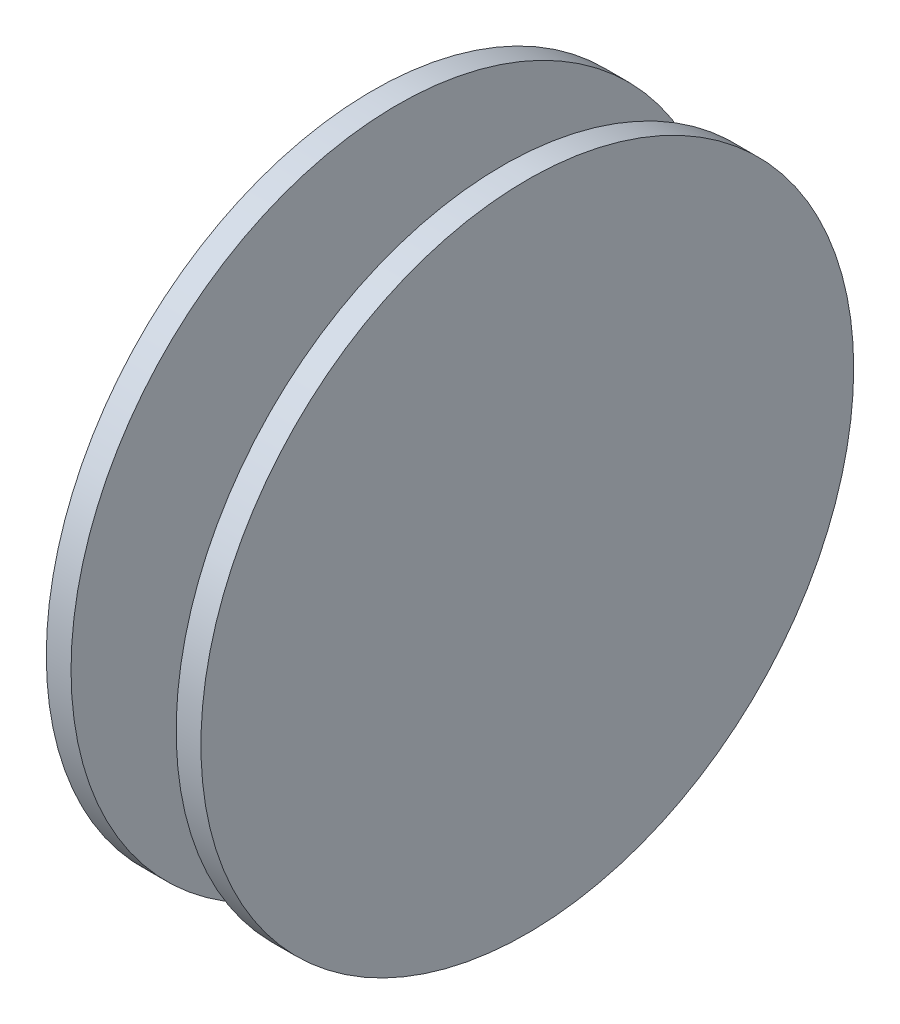
ISO-10303-21;
HEADER;
FILE_DESCRIPTION(('STEP AP214'),'2;1');
FILE_NAME('part.step','',(''),(''),'','','');
FILE_SCHEMA(('AUTOMOTIVE_DESIGN { 1 0 10303 214 1 1 1 1 }'));
ENDSEC;
DATA;
#1=APPLICATION_CONTEXT('core data for automotive mechanical design processes');
#2=APPLICATION_PROTOCOL_DEFINITION('international standard','automotive_design',2000,#1);
#3=PRODUCT_CONTEXT('',#1,'mechanical');
#4=PRODUCT('Part','Part','',(#3));
#5=PRODUCT_RELATED_PRODUCT_CATEGORY('part','',(#4));
#6=PRODUCT_DEFINITION_FORMATION('','',#4);
#7=PRODUCT_DEFINITION_CONTEXT('part definition',#1,'design');
#8=PRODUCT_DEFINITION('design','',#6,#7);
#9=PRODUCT_DEFINITION_SHAPE('','',#8);
#10=(LENGTH_UNIT() NAMED_UNIT(*) SI_UNIT(.MILLI.,.METRE.));
#11=(NAMED_UNIT(*) PLANE_ANGLE_UNIT() SI_UNIT($,.RADIAN.));
#12=(NAMED_UNIT(*) SI_UNIT($,.STERADIAN.) SOLID_ANGLE_UNIT());
#13=UNCERTAINTY_MEASURE_WITH_UNIT(LENGTH_MEASURE(1.E-05),#10,'distance_accuracy_value','');
#14=(GEOMETRIC_REPRESENTATION_CONTEXT(3) GLOBAL_UNCERTAINTY_ASSIGNED_CONTEXT((#13)) GLOBAL_UNIT_ASSIGNED_CONTEXT((#10,
#11,#12)) REPRESENTATION_CONTEXT('',''));
#15=CARTESIAN_POINT('',(0.,0.,0.));
#16=DIRECTION('',(0.,0.,1.));
#17=DIRECTION('',(1.,0.,0.));
#18=AXIS2_PLACEMENT_3D('',#15,#16,#17);
#19=CARTESIAN_POINT('',(6.35,0.,0.));
#20=DIRECTION('',(-1.,0.,0.));
#21=DIRECTION('',(0.,0.,1.));
#22=AXIS2_PLACEMENT_3D('',#19,#20,#21);
#23=CYLINDRICAL_SURFACE('',#22,83.82);
#24=CARTESIAN_POINT('',(6.35,0.,0.));
#25=DIRECTION('',(1.,0.,0.));
#26=DIRECTION('',(0.,0.,-1.));
#27=AXIS2_PLACEMENT_3D('',#24,#25,#26);
#28=CIRCLE('',#27,83.82);
#29=CARTESIAN_POINT('',(6.35,0.,-83.82));
#30=VERTEX_POINT('',#29);
#31=EDGE_CURVE('E52',#30,#30,#28,.T.);
#32=ORIENTED_EDGE('',*,*,#31,.F.);
#33=EDGE_LOOP('',(#32));
#34=FACE_BOUND('',#33,.T.);
#35=CARTESIAN_POINT('',(0.,0.,0.));
#36=DIRECTION('',(1.,0.,0.));
#37=DIRECTION('',(0.,0.,-1.));
#38=AXIS2_PLACEMENT_3D('',#35,#36,#37);
#39=CIRCLE('',#38,83.82);
#40=CARTESIAN_POINT('',(0.,0.,-83.82));
#41=VERTEX_POINT('',#40);
#42=EDGE_CURVE('E57',#41,#41,#39,.T.);
#43=ORIENTED_EDGE('',*,*,#42,.T.);
#44=EDGE_LOOP('',(#43));
#45=FACE_BOUND('',#44,.T.);
#46=ADVANCED_FACE('F45',(#34,#45),#23,.T.);
#47=CARTESIAN_POINT('',(6.35,0.,0.));
#48=DIRECTION('',(1.,0.,0.));
#49=DIRECTION('',(0.,0.,-1.));
#50=AXIS2_PLACEMENT_3D('',#47,#48,#49);
#51=PLANE('',#50);
#52=ORIENTED_EDGE('',*,*,#31,.T.);
#53=EDGE_LOOP('',(#52));
#54=FACE_BOUND('',#53,.T.);
#55=ADVANCED_FACE('F95',(#54),#51,.T.);
#56=CARTESIAN_POINT('',(0.,0.,0.));
#57=DIRECTION('',(1.,0.,0.));
#58=DIRECTION('',(0.,0.,-1.));
#59=AXIS2_PLACEMENT_3D('',#56,#57,#58);
#60=PLANE('',#59);
#61=CARTESIAN_POINT('',(0.,0.,0.));
#62=DIRECTION('',(1.,0.,0.));
#63=DIRECTION('',(0.,0.,-1.));
#64=AXIS2_PLACEMENT_3D('',#61,#62,#63);
#65=CIRCLE('',#64,5.);
#66=CARTESIAN_POINT('',(0.,0.,-5.));
#67=VERTEX_POINT('',#66);
#68=EDGE_CURVE('E10',#67,#67,#65,.F.);
#69=ORIENTED_EDGE('',*,*,#68,.F.);
#70=EDGE_LOOP('',(#69));
#71=FACE_BOUND('',#70,.T.);
#72=ORIENTED_EDGE('',*,*,#42,.F.);
#73=EDGE_LOOP('',(#72));
#74=FACE_BOUND('',#73,.T.);
#75=ADVANCED_FACE('F100',(#71,#74),#60,.F.);
#76=CARTESIAN_POINT('',(-27.,0.,0.));
#77=DIRECTION('',(1.,0.,0.));
#78=DIRECTION('',(0.,0.,-1.));
#79=AXIS2_PLACEMENT_3D('',#76,#77,#78);
#80=CYLINDRICAL_SURFACE('',#79,5.);
#81=CARTESIAN_POINT('',(-27.,0.,0.));
#82=DIRECTION('',(-1.,0.,0.));
#83=DIRECTION('',(0.,0.,1.));
#84=AXIS2_PLACEMENT_3D('',#81,#82,#83);
#85=CIRCLE('',#84,5.);
#86=CARTESIAN_POINT('',(-27.,0.,5.));
#87=VERTEX_POINT('',#86);
#88=EDGE_CURVE('E63',#87,#87,#85,.T.);
#89=ORIENTED_EDGE('',*,*,#88,.F.);
#90=EDGE_LOOP('',(#89));
#91=FACE_BOUND('',#90,.T.);
#92=ORIENTED_EDGE('',*,*,#68,.T.);
#93=EDGE_LOOP('',(#92));
#94=FACE_BOUND('',#93,.T.);
#95=ADVANCED_FACE('F82',(#91,#94),#80,.T.);
#96=CARTESIAN_POINT('',(-33.35,0.,0.));
#97=DIRECTION('',(1.,0.,0.));
#98=DIRECTION('',(0.,0.,-1.));
#99=AXIS2_PLACEMENT_3D('',#96,#97,#98);
#100=CYLINDRICAL_SURFACE('',#99,83.82);
#101=CARTESIAN_POINT('',(-33.35,0.,0.));
#102=DIRECTION('',(-1.,0.,0.));
#103=DIRECTION('',(0.,0.,1.));
#104=AXIS2_PLACEMENT_3D('',#101,#102,#103);
#105=CIRCLE('',#104,83.82);
#106=CARTESIAN_POINT('',(-33.35,0.,83.82));
#107=VERTEX_POINT('',#106);
#108=EDGE_CURVE('E68',#107,#107,#105,.T.);
#109=ORIENTED_EDGE('',*,*,#108,.F.);
#110=EDGE_LOOP('',(#109));
#111=FACE_BOUND('',#110,.T.);
#112=CARTESIAN_POINT('',(-27.,0.,0.));
#113=DIRECTION('',(-1.,0.,0.));
#114=DIRECTION('',(0.,0.,1.));
#115=AXIS2_PLACEMENT_3D('',#112,#113,#114);
#116=CIRCLE('',#115,83.82);
#117=CARTESIAN_POINT('',(-27.,0.,83.82));
#118=VERTEX_POINT('',#117);
#119=EDGE_CURVE('E69',#118,#118,#116,.T.);
#120=ORIENTED_EDGE('',*,*,#119,.T.);
#121=EDGE_LOOP('',(#120));
#122=FACE_BOUND('',#121,.T.);
#123=ADVANCED_FACE('F79',(#111,#122),#100,.T.);
#124=CARTESIAN_POINT('',(-33.35,0.,0.));
#125=DIRECTION('',(-1.,0.,0.));
#126=DIRECTION('',(0.,0.,1.));
#127=AXIS2_PLACEMENT_3D('',#124,#125,#126);
#128=PLANE('',#127);
#129=ORIENTED_EDGE('',*,*,#108,.T.);
#130=EDGE_LOOP('',(#129));
#131=FACE_BOUND('',#130,.T.);
#132=ADVANCED_FACE('F77',(#131),#128,.T.);
#133=CARTESIAN_POINT('',(-27.,0.,0.));
#134=DIRECTION('',(-1.,0.,0.));
#135=DIRECTION('',(0.,0.,1.));
#136=AXIS2_PLACEMENT_3D('',#133,#134,#135);
#137=PLANE('',#136);
#138=ORIENTED_EDGE('',*,*,#88,.T.);
#139=EDGE_LOOP('',(#138));
#140=FACE_BOUND('',#139,.T.);
#141=ORIENTED_EDGE('',*,*,#119,.F.);
#142=EDGE_LOOP('',(#141));
#143=FACE_BOUND('',#142,.T.);
#144=ADVANCED_FACE('F86',(#140,#143),#137,.F.);
#145=CLOSED_SHELL('',(#46,#55,#75,#95,#123,#132,#144));
#146=MANIFOLD_SOLID_BREP('B2',#145);
#147=ADVANCED_BREP_SHAPE_REPRESENTATION('',(#18,#146),#14);
#148=SHAPE_DEFINITION_REPRESENTATION(#9,#147);
ENDSEC;
END-ISO-10303-21;
